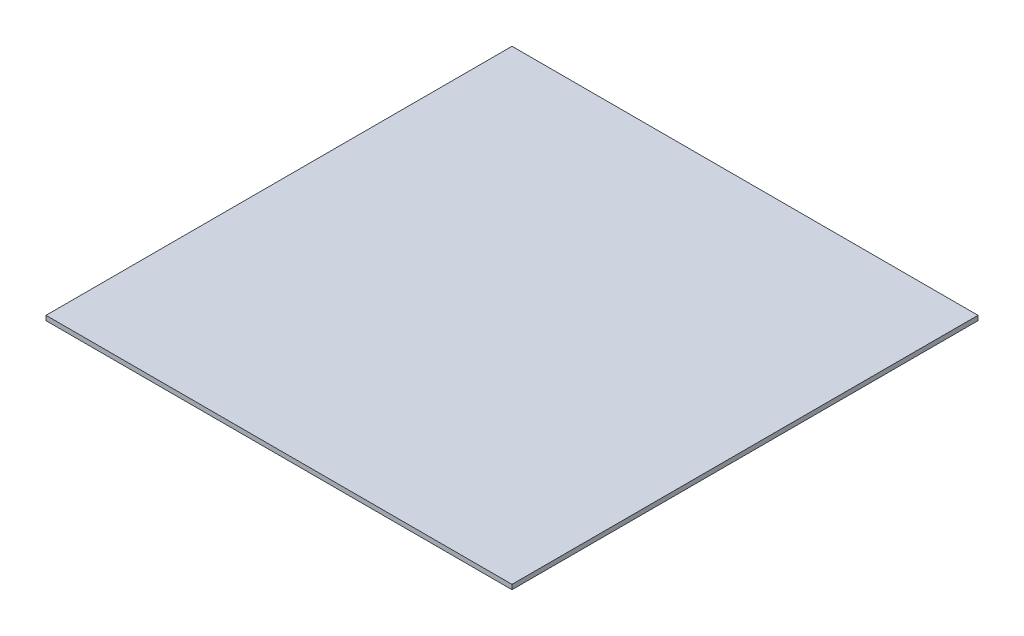
ISO-10303-21;
HEADER;
FILE_DESCRIPTION(('STEP AP214'),'2;1');
FILE_NAME('part.step','',(''),(''),'','','');
FILE_SCHEMA(('AUTOMOTIVE_DESIGN { 1 0 10303 214 1 1 1 1 }'));
ENDSEC;
DATA;
#1=APPLICATION_CONTEXT('core data for automotive mechanical design processes');
#2=APPLICATION_PROTOCOL_DEFINITION('international standard','automotive_design',2000,#1);
#3=PRODUCT_CONTEXT('',#1,'mechanical');
#4=PRODUCT('Part','Part','',(#3));
#5=PRODUCT_RELATED_PRODUCT_CATEGORY('part','',(#4));
#6=PRODUCT_DEFINITION_FORMATION('','',#4);
#7=PRODUCT_DEFINITION_CONTEXT('part definition',#1,'design');
#8=PRODUCT_DEFINITION('design','',#6,#7);
#9=PRODUCT_DEFINITION_SHAPE('','',#8);
#10=(LENGTH_UNIT() NAMED_UNIT(*) SI_UNIT(.MILLI.,.METRE.));
#11=(NAMED_UNIT(*) PLANE_ANGLE_UNIT() SI_UNIT($,.RADIAN.));
#12=(NAMED_UNIT(*) SI_UNIT($,.STERADIAN.) SOLID_ANGLE_UNIT());
#13=UNCERTAINTY_MEASURE_WITH_UNIT(LENGTH_MEASURE(1.E-05),#10,'distance_accuracy_value','');
#14=(GEOMETRIC_REPRESENTATION_CONTEXT(3) GLOBAL_UNCERTAINTY_ASSIGNED_CONTEXT((#13)) GLOBAL_UNIT_ASSIGNED_CONTEXT((#10,
#11,#12)) REPRESENTATION_CONTEXT('',''));
#15=CARTESIAN_POINT('',(0.,0.,0.));
#16=DIRECTION('',(0.,0.,1.));
#17=DIRECTION('',(1.,0.,0.));
#18=AXIS2_PLACEMENT_3D('',#15,#16,#17);
#19=CARTESIAN_POINT('',(15240.,-304.8,-15240.));
#20=DIRECTION('',(1.,0.,0.));
#21=DIRECTION('',(0.,0.,-1.));
#22=AXIS2_PLACEMENT_3D('',#19,#20,#21);
#23=PLANE('',#22);
#24=DIRECTION('',(0.,0.,-1.));
#25=VECTOR('',#24,1.);
#26=CARTESIAN_POINT('',(15240.,0.,-15240.));
#27=LINE('',#26,#25);
#28=CARTESIAN_POINT('',(15240.,0.,15240.));
#29=VERTEX_POINT('',#28);
#30=CARTESIAN_POINT('',(15240.,0.,-15240.));
#31=VERTEX_POINT('',#30);
#32=EDGE_CURVE('E94',#29,#31,#27,.T.);
#33=ORIENTED_EDGE('',*,*,#32,.F.);
#34=DIRECTION('',(0.,1.,0.));
#35=VECTOR('',#34,1.);
#36=CARTESIAN_POINT('',(15240.,-304.8,15240.));
#37=LINE('',#36,#35);
#38=CARTESIAN_POINT('',(15240.,-304.8,15240.));
#39=VERTEX_POINT('',#38);
#40=EDGE_CURVE('E11',#39,#29,#37,.T.);
#41=ORIENTED_EDGE('',*,*,#40,.F.);
#42=DIRECTION('',(0.,0.,-1.));
#43=VECTOR('',#42,1.);
#44=CARTESIAN_POINT('',(15240.,-304.8,-15240.));
#45=LINE('',#44,#43);
#46=CARTESIAN_POINT('',(15240.,-304.8,-15240.));
#47=VERTEX_POINT('',#46);
#48=EDGE_CURVE('E88',#39,#47,#45,.T.);
#49=ORIENTED_EDGE('',*,*,#48,.T.);
#50=DIRECTION('',(0.,1.,0.));
#51=VECTOR('',#50,1.);
#52=CARTESIAN_POINT('',(15240.,-304.8,-15240.));
#53=LINE('',#52,#51);
#54=EDGE_CURVE('E33',#47,#31,#53,.T.);
#55=ORIENTED_EDGE('',*,*,#54,.T.);
#56=EDGE_LOOP('',(#33,#41,#49,#55));
#57=FACE_BOUND('',#56,.T.);
#58=ADVANCED_FACE('F30',(#57),#23,.T.);
#59=CARTESIAN_POINT('',(-15240.,-304.8,15240.));
#60=DIRECTION('',(0.,0.,1.));
#61=DIRECTION('',(1.,0.,0.));
#62=AXIS2_PLACEMENT_3D('',#59,#60,#61);
#63=PLANE('',#62);
#64=DIRECTION('',(1.,0.,0.));
#65=VECTOR('',#64,1.);
#66=CARTESIAN_POINT('',(-15240.,0.,15240.));
#67=LINE('',#66,#65);
#68=CARTESIAN_POINT('',(-15240.,0.,15240.));
#69=VERTEX_POINT('',#68);
#70=EDGE_CURVE('E90',#69,#29,#67,.T.);
#71=ORIENTED_EDGE('',*,*,#70,.F.);
#72=DIRECTION('',(0.,1.,0.));
#73=VECTOR('',#72,1.);
#74=CARTESIAN_POINT('',(-15240.,-304.8,15240.));
#75=LINE('',#74,#73);
#76=CARTESIAN_POINT('',(-15240.,-304.8,15240.));
#77=VERTEX_POINT('',#76);
#78=EDGE_CURVE('E39',#77,#69,#75,.T.);
#79=ORIENTED_EDGE('',*,*,#78,.F.);
#80=DIRECTION('',(1.,0.,0.));
#81=VECTOR('',#80,1.);
#82=CARTESIAN_POINT('',(-15240.,-304.8,15240.));
#83=LINE('',#82,#81);
#84=EDGE_CURVE('E85',#77,#39,#83,.T.);
#85=ORIENTED_EDGE('',*,*,#84,.T.);
#86=ORIENTED_EDGE('',*,*,#40,.T.);
#87=EDGE_LOOP('',(#71,#79,#85,#86));
#88=FACE_BOUND('',#87,.T.);
#89=ADVANCED_FACE('F104',(#88),#63,.T.);
#90=CARTESIAN_POINT('',(-15240.,-304.8,-15240.));
#91=DIRECTION('',(-1.,0.,0.));
#92=DIRECTION('',(0.,0.,1.));
#93=AXIS2_PLACEMENT_3D('',#90,#91,#92);
#94=PLANE('',#93);
#95=DIRECTION('',(0.,0.,1.));
#96=VECTOR('',#95,1.);
#97=CARTESIAN_POINT('',(-15240.,0.,-15240.));
#98=LINE('',#97,#96);
#99=CARTESIAN_POINT('',(-15240.,0.,-15240.));
#100=VERTEX_POINT('',#99);
#101=EDGE_CURVE('E80',#100,#69,#98,.T.);
#102=ORIENTED_EDGE('',*,*,#101,.F.);
#103=DIRECTION('',(0.,1.,0.));
#104=VECTOR('',#103,1.);
#105=CARTESIAN_POINT('',(-15240.,-304.8,-15240.));
#106=LINE('',#105,#104);
#107=CARTESIAN_POINT('',(-15240.,-304.8,-15240.));
#108=VERTEX_POINT('',#107);
#109=EDGE_CURVE('E75',#108,#100,#106,.T.);
#110=ORIENTED_EDGE('',*,*,#109,.F.);
#111=DIRECTION('',(0.,0.,1.));
#112=VECTOR('',#111,1.);
#113=CARTESIAN_POINT('',(-15240.,-304.8,-15240.));
#114=LINE('',#113,#112);
#115=EDGE_CURVE('E78',#108,#77,#114,.T.);
#116=ORIENTED_EDGE('',*,*,#115,.T.);
#117=ORIENTED_EDGE('',*,*,#78,.T.);
#118=EDGE_LOOP('',(#102,#110,#116,#117));
#119=FACE_BOUND('',#118,.T.);
#120=ADVANCED_FACE('F77',(#119),#94,.T.);
#121=CARTESIAN_POINT('',(-15240.,-304.8,-15240.));
#122=DIRECTION('',(0.,0.,-1.));
#123=DIRECTION('',(-1.,0.,0.));
#124=AXIS2_PLACEMENT_3D('',#121,#122,#123);
#125=PLANE('',#124);
#126=DIRECTION('',(-1.,0.,0.));
#127=VECTOR('',#126,1.);
#128=CARTESIAN_POINT('',(-15240.,0.,-15240.));
#129=LINE('',#128,#127);
#130=EDGE_CURVE('E97',#31,#100,#129,.T.);
#131=ORIENTED_EDGE('',*,*,#130,.F.);
#132=ORIENTED_EDGE('',*,*,#54,.F.);
#133=DIRECTION('',(-1.,0.,0.));
#134=VECTOR('',#133,1.);
#135=CARTESIAN_POINT('',(-15240.,-304.8,-15240.));
#136=LINE('',#135,#134);
#137=EDGE_CURVE('E84',#47,#108,#136,.T.);
#138=ORIENTED_EDGE('',*,*,#137,.T.);
#139=ORIENTED_EDGE('',*,*,#109,.T.);
#140=EDGE_LOOP('',(#131,#132,#138,#139));
#141=FACE_BOUND('',#140,.T.);
#142=ADVANCED_FACE('F87',(#141),#125,.T.);
#143=CARTESIAN_POINT('',(15240.,-304.8,15240.));
#144=DIRECTION('',(0.,1.,0.));
#145=DIRECTION('',(0.,0.,1.));
#146=AXIS2_PLACEMENT_3D('',#143,#144,#145);
#147=PLANE('',#146);
#148=ORIENTED_EDGE('',*,*,#48,.F.);
#149=ORIENTED_EDGE('',*,*,#84,.F.);
#150=ORIENTED_EDGE('',*,*,#115,.F.);
#151=ORIENTED_EDGE('',*,*,#137,.F.);
#152=EDGE_LOOP('',(#148,#149,#150,#151));
#153=FACE_BOUND('',#152,.T.);
#154=ADVANCED_FACE('F83',(#153),#147,.F.);
#155=CARTESIAN_POINT('',(15240.,0.,15240.));
#156=DIRECTION('',(0.,1.,0.));
#157=DIRECTION('',(0.,0.,1.));
#158=AXIS2_PLACEMENT_3D('',#155,#156,#157);
#159=PLANE('',#158);
#160=ORIENTED_EDGE('',*,*,#32,.T.);
#161=ORIENTED_EDGE('',*,*,#130,.T.);
#162=ORIENTED_EDGE('',*,*,#101,.T.);
#163=ORIENTED_EDGE('',*,*,#70,.T.);
#164=EDGE_LOOP('',(#160,#161,#162,#163));
#165=FACE_BOUND('',#164,.T.);
#166=ADVANCED_FACE('F103',(#165),#159,.T.);
#167=CLOSED_SHELL('',(#58,#89,#120,#142,#154,#166));
#168=MANIFOLD_SOLID_BREP('B2',#167);
#169=ADVANCED_BREP_SHAPE_REPRESENTATION('',(#18,#168),#14);
#170=SHAPE_DEFINITION_REPRESENTATION(#9,#169);
ENDSEC;
END-ISO-10303-21;
